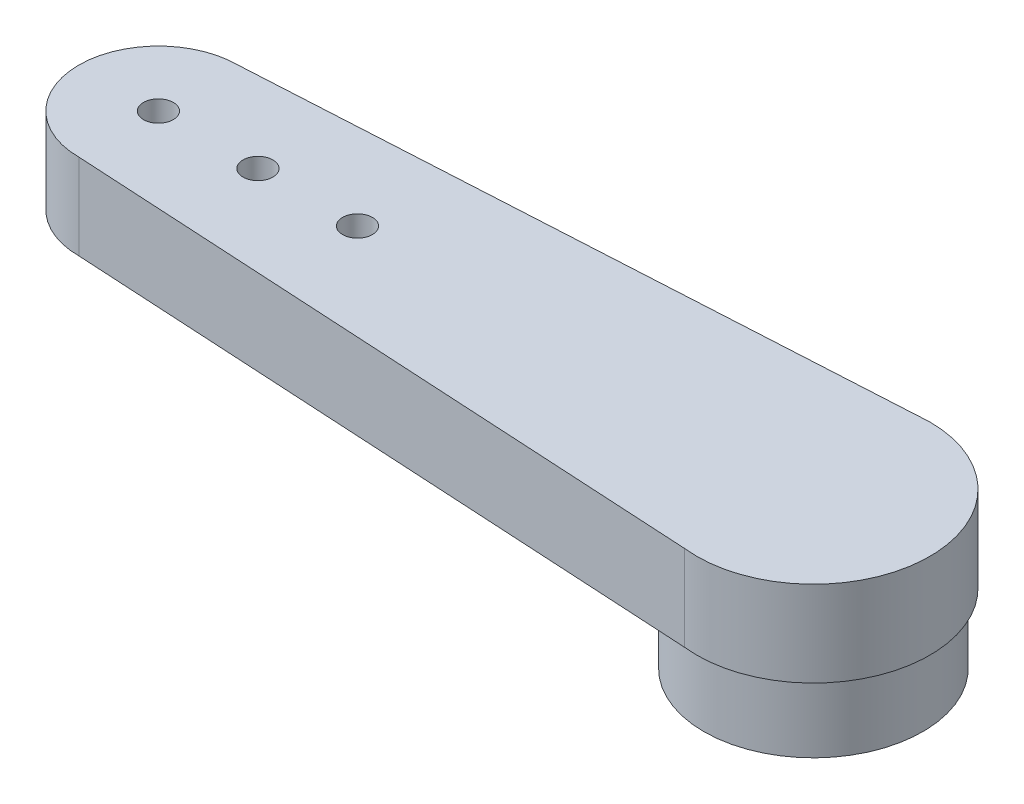
ISO-10303-21;
HEADER;
FILE_DESCRIPTION(('STEP AP214'),'2;1');
FILE_NAME('part.step','',(''),(''),'','','');
FILE_SCHEMA(('AUTOMOTIVE_DESIGN { 1 0 10303 214 1 1 1 1 }'));
ENDSEC;
DATA;
#1=APPLICATION_CONTEXT('core data for automotive mechanical design processes');
#2=APPLICATION_PROTOCOL_DEFINITION('international standard','automotive_design',2000,#1);
#3=PRODUCT_CONTEXT('',#1,'mechanical');
#4=PRODUCT('Part','Part','',(#3));
#5=PRODUCT_RELATED_PRODUCT_CATEGORY('part','',(#4));
#6=PRODUCT_DEFINITION_FORMATION('','',#4);
#7=PRODUCT_DEFINITION_CONTEXT('part definition',#1,'design');
#8=PRODUCT_DEFINITION('design','',#6,#7);
#9=PRODUCT_DEFINITION_SHAPE('','',#8);
#10=(LENGTH_UNIT() NAMED_UNIT(*) SI_UNIT(.MILLI.,.METRE.));
#11=(NAMED_UNIT(*) PLANE_ANGLE_UNIT() SI_UNIT($,.RADIAN.));
#12=(NAMED_UNIT(*) SI_UNIT($,.STERADIAN.) SOLID_ANGLE_UNIT());
#13=UNCERTAINTY_MEASURE_WITH_UNIT(LENGTH_MEASURE(1.E-05),#10,'distance_accuracy_value','');
#14=(GEOMETRIC_REPRESENTATION_CONTEXT(3) GLOBAL_UNCERTAINTY_ASSIGNED_CONTEXT((#13)) GLOBAL_UNIT_ASSIGNED_CONTEXT((#10,
#11,#12)) REPRESENTATION_CONTEXT('',''));
#15=CARTESIAN_POINT('',(0.,0.,0.));
#16=DIRECTION('',(0.,0.,1.));
#17=DIRECTION('',(1.,0.,0.));
#18=AXIS2_PLACEMENT_3D('',#15,#16,#17);
#19=CARTESIAN_POINT('',(0.,0.,0.));
#20=DIRECTION('',(0.,1.,0.));
#21=DIRECTION('',(0.,0.,1.));
#22=AXIS2_PLACEMENT_3D('',#19,#20,#21);
#23=PLANE('',#22);
#24=CARTESIAN_POINT('',(0.,0.,0.));
#25=DIRECTION('',(0.,1.,0.));
#26=DIRECTION('',(0.,0.,1.));
#27=AXIS2_PLACEMENT_3D('',#24,#25,#26);
#28=CIRCLE('',#27,1.95);
#29=CARTESIAN_POINT('',(0.,0.,1.95));
#30=VERTEX_POINT('',#29);
#31=EDGE_CURVE('E20',#30,#30,#28,.F.);
#32=ORIENTED_EDGE('',*,*,#31,.T.);
#33=EDGE_LOOP('',(#32));
#34=FACE_BOUND('',#33,.T.);
#35=ADVANCED_FACE('F17',(#34),#23,.F.);
#36=CARTESIAN_POINT('',(0.,-1.75,0.));
#37=DIRECTION('',(0.,1.,0.));
#38=DIRECTION('',(0.,0.,1.));
#39=AXIS2_PLACEMENT_3D('',#36,#37,#38);
#40=CYLINDRICAL_SURFACE('',#39,1.95);
#41=CARTESIAN_POINT('',(0.,-1.75,0.));
#42=DIRECTION('',(0.,1.,0.));
#43=DIRECTION('',(0.,0.,1.));
#44=AXIS2_PLACEMENT_3D('',#41,#42,#43);
#45=CIRCLE('',#44,1.95);
#46=CARTESIAN_POINT('',(0.,-1.75,1.95));
#47=VERTEX_POINT('',#46);
#48=EDGE_CURVE('E116',#47,#47,#45,.F.);
#49=ORIENTED_EDGE('',*,*,#48,.T.);
#50=EDGE_LOOP('',(#49));
#51=FACE_BOUND('',#50,.T.);
#52=ORIENTED_EDGE('',*,*,#31,.F.);
#53=EDGE_LOOP('',(#52));
#54=FACE_BOUND('',#53,.T.);
#55=ADVANCED_FACE('F124',(#51,#54),#40,.F.);
#56=CARTESIAN_POINT('',(0.,-1.75,0.));
#57=DIRECTION('',(0.,1.,0.));
#58=DIRECTION('',(0.,0.,1.));
#59=AXIS2_PLACEMENT_3D('',#56,#57,#58);
#60=PLANE('',#59);
#61=CARTESIAN_POINT('',(0.,-1.75,0.));
#62=DIRECTION('',(0.,1.,0.));
#63=DIRECTION('',(0.,0.,1.));
#64=AXIS2_PLACEMENT_3D('',#61,#62,#63);
#65=CIRCLE('',#64,2.75);
#66=CARTESIAN_POINT('',(0.,-1.75,2.75));
#67=VERTEX_POINT('',#66);
#68=EDGE_CURVE('E114',#67,#67,#65,.T.);
#69=ORIENTED_EDGE('',*,*,#68,.F.);
#70=EDGE_LOOP('',(#69));
#71=FACE_BOUND('',#70,.T.);
#72=ORIENTED_EDGE('',*,*,#48,.F.);
#73=EDGE_LOOP('',(#72));
#74=FACE_BOUND('',#73,.T.);
#75=ADVANCED_FACE('F126',(#71,#74),#60,.F.);
#76=CARTESIAN_POINT('',(0.,-1.75,0.));
#77=DIRECTION('',(0.,1.,0.));
#78=DIRECTION('',(0.,0.,1.));
#79=AXIS2_PLACEMENT_3D('',#76,#77,#78);
#80=CYLINDRICAL_SURFACE('',#79,2.75);
#81=CARTESIAN_POINT('',(0.,0.,0.));
#82=DIRECTION('',(0.,1.,0.));
#83=DIRECTION('',(0.,0.,1.));
#84=AXIS2_PLACEMENT_3D('',#81,#82,#83);
#85=CIRCLE('',#84,2.75);
#86=CARTESIAN_POINT('',(0.,0.,2.75));
#87=VERTEX_POINT('',#86);
#88=EDGE_CURVE('E111',#87,#87,#85,.F.);
#89=ORIENTED_EDGE('',*,*,#88,.T.);
#90=EDGE_LOOP('',(#89));
#91=FACE_BOUND('',#90,.T.);
#92=ORIENTED_EDGE('',*,*,#68,.T.);
#93=EDGE_LOOP('',(#92));
#94=FACE_BOUND('',#93,.T.);
#95=ADVANCED_FACE('F132',(#91,#94),#80,.T.);
#96=CARTESIAN_POINT('',(0.,0.,0.));
#97=DIRECTION('',(0.,1.,0.));
#98=DIRECTION('',(0.,0.,1.));
#99=AXIS2_PLACEMENT_3D('',#96,#97,#98);
#100=PLANE('',#99);
#101=CARTESIAN_POINT('',(-11.45,0.,0.));
#102=DIRECTION('',(0.,-1.,0.));
#103=DIRECTION('',(0.,0.,-1.));
#104=AXIS2_PLACEMENT_3D('',#101,#102,#103);
#105=CIRCLE('',#104,0.374999999999999);
#106=CARTESIAN_POINT('',(-11.45,0.,-0.375));
#107=VERTEX_POINT('',#106);
#108=EDGE_CURVE('E101',#107,#107,#105,.F.);
#109=ORIENTED_EDGE('',*,*,#108,.T.);
#110=EDGE_LOOP('',(#109));
#111=FACE_BOUND('',#110,.T.);
#112=DIRECTION('',(0.998422776462327,0.,0.0561423141779728));
#113=VECTOR('',#112,1.);
#114=CARTESIAN_POINT('',(-0.163957263205881,0.,2.91578051863432));
#115=LINE('',#114,#113);
#116=CARTESIAN_POINT('',(-16.45,0.,2.));
#117=VERTEX_POINT('',#116);
#118=CARTESIAN_POINT('',(-0.327914526411734,0.,2.90656103726864));
#119=VERTEX_POINT('',#118);
#120=EDGE_CURVE('E93',#117,#119,#115,.T.);
#121=ORIENTED_EDGE('',*,*,#120,.F.);
#122=CARTESIAN_POINT('',(-16.45,0.,0.));
#123=DIRECTION('',(0.,-1.,0.));
#124=DIRECTION('',(0.,0.,-1.));
#125=AXIS2_PLACEMENT_3D('',#122,#123,#124);
#126=CIRCLE('',#125,2.);
#127=CARTESIAN_POINT('',(-16.45,0.,-2.));
#128=VERTEX_POINT('',#127);
#129=EDGE_CURVE('E75',#128,#117,#126,.F.);
#130=ORIENTED_EDGE('',*,*,#129,.F.);
#131=DIRECTION('',(0.998422776462327,0.,-0.0561423141779727));
#132=VECTOR('',#131,1.);
#133=CARTESIAN_POINT('',(-0.163957263205881,0.,-2.91578051863432));
#134=LINE('',#133,#132);
#135=CARTESIAN_POINT('',(-0.327914526411734,0.,-2.90656103726864));
#136=VERTEX_POINT('',#135);
#137=EDGE_CURVE('E76',#128,#136,#134,.T.);
#138=ORIENTED_EDGE('',*,*,#137,.T.);
#139=CARTESIAN_POINT('',(0.,0.,0.));
#140=DIRECTION('',(0.,-1.,0.));
#141=DIRECTION('',(0.,0.,-1.));
#142=AXIS2_PLACEMENT_3D('',#139,#140,#141);
#143=CIRCLE('',#142,2.925);
#144=EDGE_CURVE('E71',#119,#136,#143,.F.);
#145=ORIENTED_EDGE('',*,*,#144,.F.);
#146=EDGE_LOOP('',(#121,#130,#138,#145));
#147=FACE_BOUND('',#146,.T.);
#148=CARTESIAN_POINT('',(-16.45,0.,0.));
#149=DIRECTION('',(0.,-1.,0.));
#150=DIRECTION('',(0.,0.,-1.));
#151=AXIS2_PLACEMENT_3D('',#148,#149,#150);
#152=CIRCLE('',#151,0.374999999999999);
#153=CARTESIAN_POINT('',(-16.45,0.,-0.374999999999999));
#154=VERTEX_POINT('',#153);
#155=EDGE_CURVE('E97',#154,#154,#152,.F.);
#156=ORIENTED_EDGE('',*,*,#155,.T.);
#157=EDGE_LOOP('',(#156));
#158=FACE_BOUND('',#157,.T.);
#159=CARTESIAN_POINT('',(-13.95,0.,0.));
#160=DIRECTION('',(0.,-1.,0.));
#161=DIRECTION('',(0.,0.,-1.));
#162=AXIS2_PLACEMENT_3D('',#159,#160,#161);
#163=CIRCLE('',#162,0.374999999999999);
#164=CARTESIAN_POINT('',(-13.95,0.,-0.375));
#165=VERTEX_POINT('',#164);
#166=EDGE_CURVE('E108',#165,#165,#163,.F.);
#167=ORIENTED_EDGE('',*,*,#166,.T.);
#168=EDGE_LOOP('',(#167));
#169=FACE_BOUND('',#168,.T.);
#170=ORIENTED_EDGE('',*,*,#88,.F.);
#171=EDGE_LOOP('',(#170));
#172=FACE_BOUND('',#171,.T.);
#173=ADVANCED_FACE('F163',(#111,#147,#158,#169,#172),#100,.F.);
#174=CARTESIAN_POINT('',(-13.95,2.1843381446916,0.));
#175=DIRECTION('',(0.,-1.,0.));
#176=DIRECTION('',(0.,0.,-1.));
#177=AXIS2_PLACEMENT_3D('',#174,#175,#176);
#178=CYLINDRICAL_SURFACE('',#177,0.374999999999999);
#179=ORIENTED_EDGE('',*,*,#166,.F.);
#180=EDGE_LOOP('',(#179));
#181=FACE_BOUND('',#180,.T.);
#182=CARTESIAN_POINT('',(-13.95,2.15,0.));
#183=DIRECTION('',(0.,-1.,0.));
#184=DIRECTION('',(0.,0.,-1.));
#185=AXIS2_PLACEMENT_3D('',#182,#183,#184);
#186=CIRCLE('',#185,0.374999999999999);
#187=CARTESIAN_POINT('',(-13.95,2.15,-0.375));
#188=VERTEX_POINT('',#187);
#189=EDGE_CURVE('E86',#188,#188,#186,.T.);
#190=ORIENTED_EDGE('',*,*,#189,.F.);
#191=EDGE_LOOP('',(#190));
#192=FACE_BOUND('',#191,.T.);
#193=ADVANCED_FACE('F159',(#181,#192),#178,.F.);
#194=CARTESIAN_POINT('',(-16.45,2.1843381446916,0.));
#195=DIRECTION('',(0.,-1.,0.));
#196=DIRECTION('',(0.,0.,-1.));
#197=AXIS2_PLACEMENT_3D('',#194,#195,#196);
#198=CYLINDRICAL_SURFACE('',#197,0.374999999999999);
#199=ORIENTED_EDGE('',*,*,#155,.F.);
#200=EDGE_LOOP('',(#199));
#201=FACE_BOUND('',#200,.T.);
#202=CARTESIAN_POINT('',(-16.45,2.15,0.));
#203=DIRECTION('',(0.,-1.,0.));
#204=DIRECTION('',(0.,0.,-1.));
#205=AXIS2_PLACEMENT_3D('',#202,#203,#204);
#206=CIRCLE('',#205,0.374999999999999);
#207=CARTESIAN_POINT('',(-16.45,2.15,-0.374999999999999));
#208=VERTEX_POINT('',#207);
#209=EDGE_CURVE('E82',#208,#208,#206,.T.);
#210=ORIENTED_EDGE('',*,*,#209,.F.);
#211=EDGE_LOOP('',(#210));
#212=FACE_BOUND('',#211,.T.);
#213=ADVANCED_FACE('F156',(#201,#212),#198,.F.);
#214=CARTESIAN_POINT('',(-0.163957263205881,2.15,-2.91578051863432));
#215=DIRECTION('',(0.0561423141779727,0.,0.998422776462327));
#216=DIRECTION('',(0.998422776462327,0.,-0.0561423141779727));
#217=AXIS2_PLACEMENT_3D('',#214,#215,#216);
#218=PLANE('',#217);
#219=ORIENTED_EDGE('',*,*,#137,.F.);
#220=DIRECTION('',(0.,-1.,0.));
#221=VECTOR('',#220,1.);
#222=CARTESIAN_POINT('',(-16.45,2.15,-2.));
#223=LINE('',#222,#221);
#224=CARTESIAN_POINT('',(-16.45,2.15,-2.));
#225=VERTEX_POINT('',#224);
#226=EDGE_CURVE('E80',#225,#128,#223,.T.);
#227=ORIENTED_EDGE('',*,*,#226,.F.);
#228=DIRECTION('',(-0.998422776462327,0.,0.0561423141779727));
#229=VECTOR('',#228,1.);
#230=CARTESIAN_POINT('',(-0.327914526411734,2.15,-2.90656103726864));
#231=LINE('',#230,#229);
#232=CARTESIAN_POINT('',(-0.327914526411723,2.15,-2.90656103726864));
#233=VERTEX_POINT('',#232);
#234=EDGE_CURVE('E65',#233,#225,#231,.T.);
#235=ORIENTED_EDGE('',*,*,#234,.F.);
#236=DIRECTION('',(0.,1.,0.));
#237=VECTOR('',#236,1.);
#238=CARTESIAN_POINT('',(-0.327914526411734,2.15,-2.90656103726864));
#239=LINE('',#238,#237);
#240=EDGE_CURVE('E69',#136,#233,#239,.T.);
#241=ORIENTED_EDGE('',*,*,#240,.F.);
#242=EDGE_LOOP('',(#219,#227,#235,#241));
#243=FACE_BOUND('',#242,.T.);
#244=ADVANCED_FACE('F78',(#243),#218,.F.);
#245=CARTESIAN_POINT('',(-16.45,2.15,0.));
#246=DIRECTION('',(0.,-1.,0.));
#247=DIRECTION('',(0.,0.,-1.));
#248=AXIS2_PLACEMENT_3D('',#245,#246,#247);
#249=CYLINDRICAL_SURFACE('',#248,2.);
#250=CARTESIAN_POINT('',(-16.45,2.15,0.));
#251=DIRECTION('',(0.,-1.,0.));
#252=DIRECTION('',(0.,0.,-1.));
#253=AXIS2_PLACEMENT_3D('',#250,#251,#252);
#254=CIRCLE('',#253,2.);
#255=CARTESIAN_POINT('',(-16.45,2.15,2.));
#256=VERTEX_POINT('',#255);
#257=EDGE_CURVE('E81',#225,#256,#254,.F.);
#258=ORIENTED_EDGE('',*,*,#257,.F.);
#259=ORIENTED_EDGE('',*,*,#226,.T.);
#260=ORIENTED_EDGE('',*,*,#129,.T.);
#261=DIRECTION('',(0.,1.,0.));
#262=VECTOR('',#261,1.);
#263=CARTESIAN_POINT('',(-16.45,2.15,2.));
#264=LINE('',#263,#262);
#265=EDGE_CURVE('E41',#256,#117,#264,.F.);
#266=ORIENTED_EDGE('',*,*,#265,.F.);
#267=EDGE_LOOP('',(#258,#259,#260,#266));
#268=FACE_BOUND('',#267,.T.);
#269=ADVANCED_FACE('F150',(#268),#249,.T.);
#270=CARTESIAN_POINT('',(-0.163957263205881,2.15,2.91578051863432));
#271=DIRECTION('',(-0.0561423141779728,0.,0.998422776462327));
#272=DIRECTION('',(0.998422776462327,0.,0.0561423141779728));
#273=AXIS2_PLACEMENT_3D('',#270,#271,#272);
#274=PLANE('',#273);
#275=DIRECTION('',(0.998422776462327,0.,0.0561423141779727));
#276=VECTOR('',#275,1.);
#277=CARTESIAN_POINT('',(-16.45,2.15,2.));
#278=LINE('',#277,#276);
#279=CARTESIAN_POINT('',(-0.327914526411726,2.15,2.90656103726864));
#280=VERTEX_POINT('',#279);
#281=EDGE_CURVE('E66',#256,#280,#278,.T.);
#282=ORIENTED_EDGE('',*,*,#281,.F.);
#283=ORIENTED_EDGE('',*,*,#265,.T.);
#284=ORIENTED_EDGE('',*,*,#120,.T.);
#285=DIRECTION('',(0.,1.,0.));
#286=VECTOR('',#285,1.);
#287=CARTESIAN_POINT('',(-0.327914526411734,2.15,2.90656103726864));
#288=LINE('',#287,#286);
#289=EDGE_CURVE('E91',#119,#280,#288,.T.);
#290=ORIENTED_EDGE('',*,*,#289,.T.);
#291=EDGE_LOOP('',(#282,#283,#284,#290));
#292=FACE_BOUND('',#291,.T.);
#293=ADVANCED_FACE('F147',(#292),#274,.T.);
#294=CARTESIAN_POINT('',(0.,2.15,0.));
#295=DIRECTION('',(0.,-1.,0.));
#296=DIRECTION('',(0.,0.,-1.));
#297=AXIS2_PLACEMENT_3D('',#294,#295,#296);
#298=CYLINDRICAL_SURFACE('',#297,2.925);
#299=ORIENTED_EDGE('',*,*,#144,.T.);
#300=ORIENTED_EDGE('',*,*,#240,.T.);
#301=CARTESIAN_POINT('',(0.,2.15,0.));
#302=DIRECTION('',(0.,-1.,0.));
#303=DIRECTION('',(0.,0.,-1.));
#304=AXIS2_PLACEMENT_3D('',#301,#302,#303);
#305=CIRCLE('',#304,2.925);
#306=EDGE_CURVE('E25',#280,#233,#305,.F.);
#307=ORIENTED_EDGE('',*,*,#306,.F.);
#308=ORIENTED_EDGE('',*,*,#289,.F.);
#309=EDGE_LOOP('',(#299,#300,#307,#308));
#310=FACE_BOUND('',#309,.T.);
#311=ADVANCED_FACE('F70',(#310),#298,.T.);
#312=CARTESIAN_POINT('',(-11.45,2.1843381446916,0.));
#313=DIRECTION('',(0.,-1.,0.));
#314=DIRECTION('',(0.,0.,-1.));
#315=AXIS2_PLACEMENT_3D('',#312,#313,#314);
#316=CYLINDRICAL_SURFACE('',#315,0.374999999999999);
#317=ORIENTED_EDGE('',*,*,#108,.F.);
#318=EDGE_LOOP('',(#317));
#319=FACE_BOUND('',#318,.T.);
#320=CARTESIAN_POINT('',(-11.45,2.15,0.));
#321=DIRECTION('',(0.,-1.,0.));
#322=DIRECTION('',(0.,0.,-1.));
#323=AXIS2_PLACEMENT_3D('',#320,#321,#322);
#324=CIRCLE('',#323,0.374999999999999);
#325=CARTESIAN_POINT('',(-11.45,2.15,-0.375));
#326=VERTEX_POINT('',#325);
#327=EDGE_CURVE('E10',#326,#326,#324,.T.);
#328=ORIENTED_EDGE('',*,*,#327,.F.);
#329=EDGE_LOOP('',(#328));
#330=FACE_BOUND('',#329,.T.);
#331=ADVANCED_FACE('F136',(#319,#330),#316,.F.);
#332=CARTESIAN_POINT('',(0.,2.15,0.));
#333=DIRECTION('',(0.,1.,0.));
#334=DIRECTION('',(0.,0.,1.));
#335=AXIS2_PLACEMENT_3D('',#332,#333,#334);
#336=PLANE('',#335);
#337=ORIENTED_EDGE('',*,*,#327,.T.);
#338=EDGE_LOOP('',(#337));
#339=FACE_BOUND('',#338,.T.);
#340=ORIENTED_EDGE('',*,*,#281,.T.);
#341=ORIENTED_EDGE('',*,*,#306,.T.);
#342=ORIENTED_EDGE('',*,*,#234,.T.);
#343=ORIENTED_EDGE('',*,*,#257,.T.);
#344=EDGE_LOOP('',(#340,#341,#342,#343));
#345=FACE_BOUND('',#344,.T.);
#346=ORIENTED_EDGE('',*,*,#209,.T.);
#347=EDGE_LOOP('',(#346));
#348=FACE_BOUND('',#347,.T.);
#349=ORIENTED_EDGE('',*,*,#189,.T.);
#350=EDGE_LOOP('',(#349));
#351=FACE_BOUND('',#350,.T.);
#352=ADVANCED_FACE('F61',(#339,#345,#348,#351),#336,.T.);
#353=CLOSED_SHELL('',(#35,#55,#75,#95,#173,#193,#213,#244,#269,#293,#311,#331,#352));
#354=MANIFOLD_SOLID_BREP('B1',#353);
#355=ADVANCED_BREP_SHAPE_REPRESENTATION('',(#18,#354),#14);
#356=SHAPE_DEFINITION_REPRESENTATION(#9,#355);
ENDSEC;
END-ISO-10303-21;
